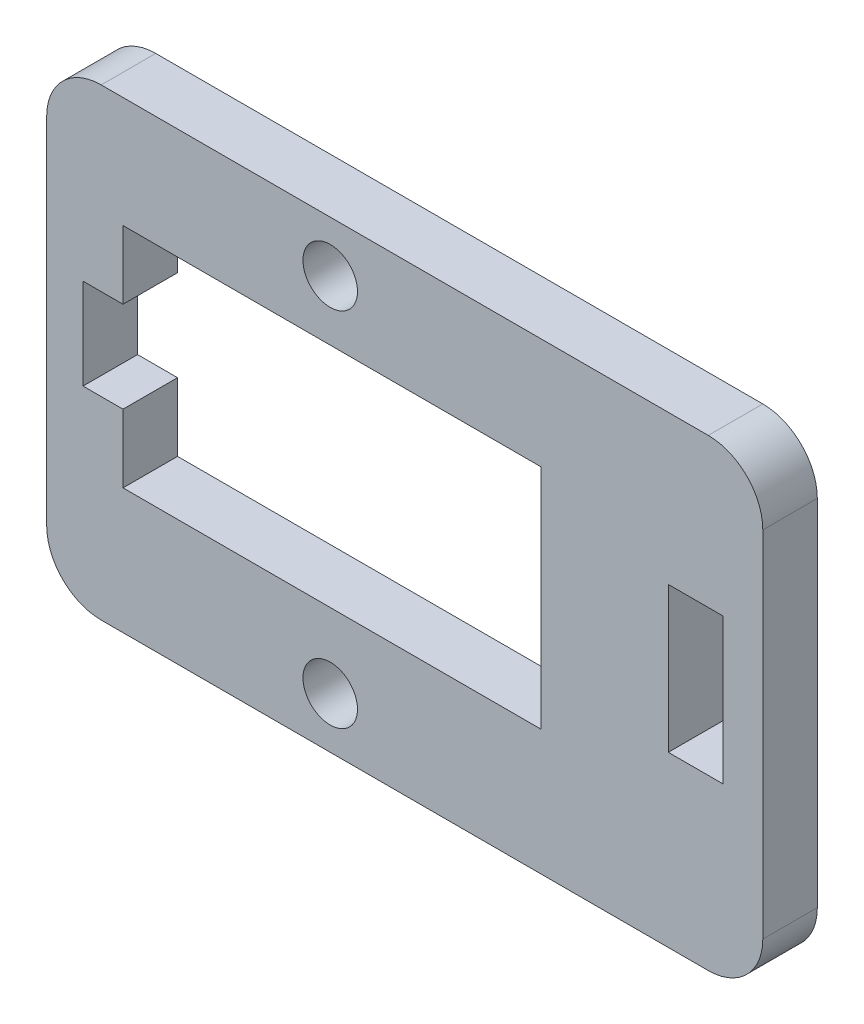
ISO-10303-21;
HEADER;
FILE_DESCRIPTION(('STEP AP214'),'2;1');
FILE_NAME('part.step','',(''),(''),'','','');
FILE_SCHEMA(('AUTOMOTIVE_DESIGN { 1 0 10303 214 1 1 1 1 }'));
ENDSEC;
DATA;
#1=APPLICATION_CONTEXT('core data for automotive mechanical design processes');
#2=APPLICATION_PROTOCOL_DEFINITION('international standard','automotive_design',2000,#1);
#3=PRODUCT_CONTEXT('',#1,'mechanical');
#4=PRODUCT('Part','Part','',(#3));
#5=PRODUCT_RELATED_PRODUCT_CATEGORY('part','',(#4));
#6=PRODUCT_DEFINITION_FORMATION('','',#4);
#7=PRODUCT_DEFINITION_CONTEXT('part definition',#1,'design');
#8=PRODUCT_DEFINITION('design','',#6,#7);
#9=PRODUCT_DEFINITION_SHAPE('','',#8);
#10=(LENGTH_UNIT() NAMED_UNIT(*) SI_UNIT(.MILLI.,.METRE.));
#11=(NAMED_UNIT(*) PLANE_ANGLE_UNIT() SI_UNIT($,.RADIAN.));
#12=(NAMED_UNIT(*) SI_UNIT($,.STERADIAN.) SOLID_ANGLE_UNIT());
#13=UNCERTAINTY_MEASURE_WITH_UNIT(LENGTH_MEASURE(1.E-05),#10,'distance_accuracy_value','');
#14=(GEOMETRIC_REPRESENTATION_CONTEXT(3) GLOBAL_UNCERTAINTY_ASSIGNED_CONTEXT((#13)) GLOBAL_UNIT_ASSIGNED_CONTEXT((#10,
#11,#12)) REPRESENTATION_CONTEXT('',''));
#15=CARTESIAN_POINT('',(0.,0.,0.));
#16=DIRECTION('',(0.,0.,1.));
#17=DIRECTION('',(1.,0.,0.));
#18=AXIS2_PLACEMENT_3D('',#15,#16,#17);
#19=CARTESIAN_POINT('',(853.5431015994,2007.83579040238,-3.));
#20=DIRECTION('',(-1.,0.,0.));
#21=DIRECTION('',(0.,0.,1.));
#22=AXIS2_PLACEMENT_3D('',#19,#20,#21);
#23=PLANE('',#22);
#24=DIRECTION('',(0.,-1.,0.));
#25=VECTOR('',#24,1.);
#26=CARTESIAN_POINT('',(853.5431015994,2007.83579040238,-3.));
#27=LINE('',#26,#25);
#28=CARTESIAN_POINT('',(853.5431015994,2004.83579040238,-3.));
#29=VERTEX_POINT('',#28);
#30=CARTESIAN_POINT('',(853.5431015994,1985.33579040238,-3.));
#31=VERTEX_POINT('',#30);
#32=EDGE_CURVE('E296',#29,#31,#27,.T.);
#33=ORIENTED_EDGE('',*,*,#32,.T.);
#34=DIRECTION('',(0.,0.,1.));
#35=VECTOR('',#34,1.);
#36=CARTESIAN_POINT('',(853.5431015994,1985.33579040238,-3.));
#37=LINE('',#36,#35);
#38=CARTESIAN_POINT('',(853.5431015994,1985.33579040238,0.));
#39=VERTEX_POINT('',#38);
#40=EDGE_CURVE('E320',#31,#39,#37,.T.);
#41=ORIENTED_EDGE('',*,*,#40,.T.);
#42=DIRECTION('',(0.,-1.,0.));
#43=VECTOR('',#42,1.);
#44=CARTESIAN_POINT('',(853.5431015994,2007.83579040238,0.));
#45=LINE('',#44,#43);
#46=CARTESIAN_POINT('',(853.5431015994,2004.83579040238,0.));
#47=VERTEX_POINT('',#46);
#48=EDGE_CURVE('E281',#47,#39,#45,.T.);
#49=ORIENTED_EDGE('',*,*,#48,.F.);
#50=DIRECTION('',(0.,0.,1.));
#51=VECTOR('',#50,1.);
#52=CARTESIAN_POINT('',(853.5431015994,2004.83579040238,-3.));
#53=LINE('',#52,#51);
#54=EDGE_CURVE('E308',#47,#29,#53,.F.);
#55=ORIENTED_EDGE('',*,*,#54,.T.);
#56=EDGE_LOOP('',(#33,#41,#49,#55));
#57=FACE_BOUND('',#56,.T.);
#58=ADVANCED_FACE('F38',(#57),#23,.T.);
#59=CARTESIAN_POINT('',(853.5431015994,2007.83579040238,-3.));
#60=DIRECTION('',(0.,1.,0.));
#61=DIRECTION('',(0.,0.,1.));
#62=AXIS2_PLACEMENT_3D('',#59,#60,#61);
#63=PLANE('',#62);
#64=DIRECTION('',(-1.,0.,0.));
#65=VECTOR('',#64,1.);
#66=CARTESIAN_POINT('',(853.5431015994,2007.83579040238,0.));
#67=LINE('',#66,#65);
#68=CARTESIAN_POINT('',(889.9431015994,2007.83579040238,0.));
#69=VERTEX_POINT('',#68);
#70=CARTESIAN_POINT('',(856.5431015994,2007.83579040238,0.));
#71=VERTEX_POINT('',#70);
#72=EDGE_CURVE('E300',#69,#71,#67,.T.);
#73=ORIENTED_EDGE('',*,*,#72,.F.);
#74=DIRECTION('',(0.,0.,1.));
#75=VECTOR('',#74,1.);
#76=CARTESIAN_POINT('',(889.9431015994,2007.83579040238,-3.));
#77=LINE('',#76,#75);
#78=CARTESIAN_POINT('',(889.9431015994,2007.83579040238,-3.));
#79=VERTEX_POINT('',#78);
#80=EDGE_CURVE('E11',#69,#79,#77,.F.);
#81=ORIENTED_EDGE('',*,*,#80,.T.);
#82=DIRECTION('',(-1.,0.,0.));
#83=VECTOR('',#82,1.);
#84=CARTESIAN_POINT('',(853.5431015994,2007.83579040238,-3.));
#85=LINE('',#84,#83);
#86=CARTESIAN_POINT('',(856.5431015994,2007.83579040238,-3.));
#87=VERTEX_POINT('',#86);
#88=EDGE_CURVE('E305',#79,#87,#85,.T.);
#89=ORIENTED_EDGE('',*,*,#88,.T.);
#90=DIRECTION('',(0.,0.,1.));
#91=VECTOR('',#90,1.);
#92=CARTESIAN_POINT('',(856.5431015994,2007.83579040238,-3.));
#93=LINE('',#92,#91);
#94=EDGE_CURVE('E46',#87,#71,#93,.T.);
#95=ORIENTED_EDGE('',*,*,#94,.T.);
#96=EDGE_LOOP('',(#73,#81,#89,#95));
#97=FACE_BOUND('',#96,.T.);
#98=ADVANCED_FACE('F350',(#97),#63,.T.);
#99=CARTESIAN_POINT('',(892.9431015994,1982.33579040238,-3.));
#100=DIRECTION('',(1.,0.,0.));
#101=DIRECTION('',(0.,0.,-1.));
#102=AXIS2_PLACEMENT_3D('',#99,#100,#101);
#103=PLANE('',#102);
#104=DIRECTION('',(0.,1.,0.));
#105=VECTOR('',#104,1.);
#106=CARTESIAN_POINT('',(892.9431015994,1982.33579040238,0.));
#107=LINE('',#106,#105);
#108=CARTESIAN_POINT('',(892.9431015994,1985.33579040238,0.));
#109=VERTEX_POINT('',#108);
#110=CARTESIAN_POINT('',(892.9431015994,2004.83579040238,0.));
#111=VERTEX_POINT('',#110);
#112=EDGE_CURVE('E314',#109,#111,#107,.T.);
#113=ORIENTED_EDGE('',*,*,#112,.F.);
#114=DIRECTION('',(0.,0.,1.));
#115=VECTOR('',#114,1.);
#116=CARTESIAN_POINT('',(892.9431015994,1985.33579040238,-3.));
#117=LINE('',#116,#115);
#118=CARTESIAN_POINT('',(892.9431015994,1985.33579040238,-3.));
#119=VERTEX_POINT('',#118);
#120=EDGE_CURVE('E60',#109,#119,#117,.F.);
#121=ORIENTED_EDGE('',*,*,#120,.T.);
#122=DIRECTION('',(0.,1.,0.));
#123=VECTOR('',#122,1.);
#124=CARTESIAN_POINT('',(892.9431015994,1982.33579040238,-3.));
#125=LINE('',#124,#123);
#126=CARTESIAN_POINT('',(892.9431015994,2004.83579040238,-3.));
#127=VERTEX_POINT('',#126);
#128=EDGE_CURVE('E303',#119,#127,#125,.T.);
#129=ORIENTED_EDGE('',*,*,#128,.T.);
#130=DIRECTION('',(0.,0.,1.));
#131=VECTOR('',#130,1.);
#132=CARTESIAN_POINT('',(892.9431015994,2004.83579040238,-3.));
#133=LINE('',#132,#131);
#134=EDGE_CURVE('E343',#127,#111,#133,.T.);
#135=ORIENTED_EDGE('',*,*,#134,.T.);
#136=EDGE_LOOP('',(#113,#121,#129,#135));
#137=FACE_BOUND('',#136,.T.);
#138=ADVANCED_FACE('F360',(#137),#103,.T.);
#139=CARTESIAN_POINT('',(853.5431015994,1982.33579040238,-3.));
#140=DIRECTION('',(0.,-1.,0.));
#141=DIRECTION('',(0.,0.,-1.));
#142=AXIS2_PLACEMENT_3D('',#139,#140,#141);
#143=PLANE('',#142);
#144=DIRECTION('',(1.,0.,0.));
#145=VECTOR('',#144,1.);
#146=CARTESIAN_POINT('',(853.5431015994,1982.33579040238,0.));
#147=LINE('',#146,#145);
#148=CARTESIAN_POINT('',(856.5431015994,1982.33579040238,0.));
#149=VERTEX_POINT('',#148);
#150=CARTESIAN_POINT('',(889.9431015994,1982.33579040238,0.));
#151=VERTEX_POINT('',#150);
#152=EDGE_CURVE('E311',#149,#151,#147,.T.);
#153=ORIENTED_EDGE('',*,*,#152,.F.);
#154=DIRECTION('',(0.,0.,1.));
#155=VECTOR('',#154,1.);
#156=CARTESIAN_POINT('',(856.5431015994,1982.33579040238,-3.));
#157=LINE('',#156,#155);
#158=CARTESIAN_POINT('',(856.5431015994,1982.33579040238,-3.));
#159=VERTEX_POINT('',#158);
#160=EDGE_CURVE('E334',#149,#159,#157,.F.);
#161=ORIENTED_EDGE('',*,*,#160,.T.);
#162=DIRECTION('',(1.,0.,0.));
#163=VECTOR('',#162,1.);
#164=CARTESIAN_POINT('',(853.5431015994,1982.33579040238,-3.));
#165=LINE('',#164,#163);
#166=CARTESIAN_POINT('',(889.9431015994,1982.33579040238,-3.));
#167=VERTEX_POINT('',#166);
#168=EDGE_CURVE('E299',#159,#167,#165,.T.);
#169=ORIENTED_EDGE('',*,*,#168,.T.);
#170=DIRECTION('',(0.,0.,1.));
#171=VECTOR('',#170,1.);
#172=CARTESIAN_POINT('',(889.9431015994,1982.33579040238,-3.));
#173=LINE('',#172,#171);
#174=EDGE_CURVE('E331',#167,#151,#173,.T.);
#175=ORIENTED_EDGE('',*,*,#174,.T.);
#176=EDGE_LOOP('',(#153,#161,#169,#175));
#177=FACE_BOUND('',#176,.T.);
#178=ADVANCED_FACE('F368',(#177),#143,.T.);
#179=CARTESIAN_POINT('',(0.,0.,-3.));
#180=DIRECTION('',(0.,0.,1.));
#181=DIRECTION('',(1.,0.,0.));
#182=AXIS2_PLACEMENT_3D('',#179,#180,#181);
#183=PLANE('',#182);
#184=DIRECTION('',(-1.,0.,0.));
#185=VECTOR('',#184,1.);
#186=CARTESIAN_POINT('',(887.743101599399,1999.63579040238,-3.));
#187=LINE('',#186,#185);
#188=CARTESIAN_POINT('',(890.743101599399,1999.63579040238,-3.));
#189=VERTEX_POINT('',#188);
#190=CARTESIAN_POINT('',(887.743101599399,1999.63579040238,-3.));
#191=VERTEX_POINT('',#190);
#192=EDGE_CURVE('E188',#189,#191,#187,.T.);
#193=ORIENTED_EDGE('',*,*,#192,.T.);
#194=DIRECTION('',(0.,-1.,0.));
#195=VECTOR('',#194,1.);
#196=CARTESIAN_POINT('',(887.743101599399,1999.63579040238,-3.));
#197=LINE('',#196,#195);
#198=CARTESIAN_POINT('',(887.743101599399,1991.63579040238,-3.));
#199=VERTEX_POINT('',#198);
#200=EDGE_CURVE('E180',#191,#199,#197,.T.);
#201=ORIENTED_EDGE('',*,*,#200,.T.);
#202=DIRECTION('',(1.,0.,0.));
#203=VECTOR('',#202,1.);
#204=CARTESIAN_POINT('',(887.743101599399,1991.63579040238,-3.));
#205=LINE('',#204,#203);
#206=CARTESIAN_POINT('',(890.743101599399,1991.63579040238,-3.));
#207=VERTEX_POINT('',#206);
#208=EDGE_CURVE('E192',#199,#207,#205,.T.);
#209=ORIENTED_EDGE('',*,*,#208,.T.);
#210=DIRECTION('',(0.,1.,0.));
#211=VECTOR('',#210,1.);
#212=CARTESIAN_POINT('',(890.743101599399,1999.63579040238,-3.));
#213=LINE('',#212,#211);
#214=EDGE_CURVE('E196',#207,#189,#213,.T.);
#215=ORIENTED_EDGE('',*,*,#214,.T.);
#216=EDGE_LOOP('',(#193,#201,#209,#215));
#217=FACE_BOUND('',#216,.T.);
#218=CARTESIAN_POINT('',(869.143101599399,1985.13557748833,-3.));
#219=DIRECTION('',(0.,0.,1.));
#220=DIRECTION('',(1.,0.,0.));
#221=AXIS2_PLACEMENT_3D('',#218,#219,#220);
#222=CIRCLE('',#221,1.49999999999994);
#223=CARTESIAN_POINT('',(870.643101599399,1985.13557748833,-3.));
#224=VERTEX_POINT('',#223);
#225=EDGE_CURVE('E220',#224,#224,#222,.T.);
#226=ORIENTED_EDGE('',*,*,#225,.T.);
#227=EDGE_LOOP('',(#226));
#228=FACE_BOUND('',#227,.T.);
#229=CARTESIAN_POINT('',(869.143101599399,2005.03579040238,-3.));
#230=DIRECTION('',(0.,0.,1.));
#231=DIRECTION('',(1.,0.,0.));
#232=AXIS2_PLACEMENT_3D('',#229,#230,#231);
#233=CIRCLE('',#232,1.49999999999994);
#234=CARTESIAN_POINT('',(870.643101599399,2005.03579040238,-3.));
#235=VERTEX_POINT('',#234);
#236=EDGE_CURVE('E226',#235,#235,#233,.T.);
#237=ORIENTED_EDGE('',*,*,#236,.T.);
#238=EDGE_LOOP('',(#237));
#239=FACE_BOUND('',#238,.T.);
#240=DIRECTION('',(-1.,0.,0.));
#241=VECTOR('',#240,1.);
#242=CARTESIAN_POINT('',(857.743101599399,2001.73579040238,-3.));
#243=LINE('',#242,#241);
#244=CARTESIAN_POINT('',(880.743101599399,2001.73579040238,-3.));
#245=VERTEX_POINT('',#244);
#246=CARTESIAN_POINT('',(857.743101599399,2001.73579040238,-3.));
#247=VERTEX_POINT('',#246);
#248=EDGE_CURVE('E254',#245,#247,#243,.T.);
#249=ORIENTED_EDGE('',*,*,#248,.T.);
#250=DIRECTION('',(0.,-1.,0.));
#251=VECTOR('',#250,1.);
#252=CARTESIAN_POINT('',(857.743101599399,2001.73579040238,-3.));
#253=LINE('',#252,#251);
#254=CARTESIAN_POINT('',(857.743101599399,1997.98579040238,-3.));
#255=VERTEX_POINT('',#254);
#256=EDGE_CURVE('E232',#247,#255,#253,.T.);
#257=ORIENTED_EDGE('',*,*,#256,.T.);
#258=DIRECTION('',(-1.,0.,0.));
#259=VECTOR('',#258,1.);
#260=CARTESIAN_POINT('',(857.743101599399,1997.98579040238,-3.));
#261=LINE('',#260,#259);
#262=CARTESIAN_POINT('',(855.543101599399,1997.98579040238,-3.));
#263=VERTEX_POINT('',#262);
#264=EDGE_CURVE('E235',#255,#263,#261,.T.);
#265=ORIENTED_EDGE('',*,*,#264,.T.);
#266=DIRECTION('',(0.,-1.,0.));
#267=VECTOR('',#266,1.);
#268=CARTESIAN_POINT('',(855.543101599399,1997.98579040238,-3.));
#269=LINE('',#268,#267);
#270=CARTESIAN_POINT('',(855.543101599399,1992.98579040238,-3.));
#271=VERTEX_POINT('',#270);
#272=EDGE_CURVE('E239',#263,#271,#269,.T.);
#273=ORIENTED_EDGE('',*,*,#272,.T.);
#274=DIRECTION('',(1.,0.,0.));
#275=VECTOR('',#274,1.);
#276=CARTESIAN_POINT('',(855.543101599399,1992.98579040238,-3.));
#277=LINE('',#276,#275);
#278=CARTESIAN_POINT('',(857.743101599399,1992.98579040238,-3.));
#279=VERTEX_POINT('',#278);
#280=EDGE_CURVE('E242',#271,#279,#277,.T.);
#281=ORIENTED_EDGE('',*,*,#280,.T.);
#282=DIRECTION('',(0.,-1.,0.));
#283=VECTOR('',#282,1.);
#284=CARTESIAN_POINT('',(857.743101599399,1992.98579040238,-3.));
#285=LINE('',#284,#283);
#286=CARTESIAN_POINT('',(857.743101599399,1989.23579040238,-3.));
#287=VERTEX_POINT('',#286);
#288=EDGE_CURVE('E245',#279,#287,#285,.T.);
#289=ORIENTED_EDGE('',*,*,#288,.T.);
#290=DIRECTION('',(1.,0.,0.));
#291=VECTOR('',#290,1.);
#292=CARTESIAN_POINT('',(857.743101599399,1989.23579040238,-3.));
#293=LINE('',#292,#291);
#294=CARTESIAN_POINT('',(880.743101599399,1989.23579040238,-3.));
#295=VERTEX_POINT('',#294);
#296=EDGE_CURVE('E248',#287,#295,#293,.T.);
#297=ORIENTED_EDGE('',*,*,#296,.T.);
#298=DIRECTION('',(0.,1.,0.));
#299=VECTOR('',#298,1.);
#300=CARTESIAN_POINT('',(880.743101599399,2001.73579040238,-3.));
#301=LINE('',#300,#299);
#302=EDGE_CURVE('E251',#295,#245,#301,.T.);
#303=ORIENTED_EDGE('',*,*,#302,.T.);
#304=EDGE_LOOP('',(#249,#257,#265,#273,#281,#289,#297,#303));
#305=FACE_BOUND('',#304,.T.);
#306=ORIENTED_EDGE('',*,*,#168,.F.);
#307=CARTESIAN_POINT('',(856.5431015994,1985.33579040238,-3.));
#308=DIRECTION('',(0.,0.,1.));
#309=DIRECTION('',(1.,0.,0.));
#310=AXIS2_PLACEMENT_3D('',#307,#308,#309);
#311=CIRCLE('',#310,3.);
#312=EDGE_CURVE('E341',#159,#31,#311,.F.);
#313=ORIENTED_EDGE('',*,*,#312,.T.);
#314=ORIENTED_EDGE('',*,*,#32,.F.);
#315=CARTESIAN_POINT('',(856.5431015994,2004.83579040238,-3.));
#316=DIRECTION('',(0.,0.,1.));
#317=DIRECTION('',(1.,0.,0.));
#318=AXIS2_PLACEMENT_3D('',#315,#316,#317);
#319=CIRCLE('',#318,3.);
#320=EDGE_CURVE('E336',#29,#87,#319,.F.);
#321=ORIENTED_EDGE('',*,*,#320,.T.);
#322=ORIENTED_EDGE('',*,*,#88,.F.);
#323=CARTESIAN_POINT('',(889.9431015994,2004.83579040238,-3.));
#324=DIRECTION('',(0.,0.,1.));
#325=DIRECTION('',(1.,0.,0.));
#326=AXIS2_PLACEMENT_3D('',#323,#324,#325);
#327=CIRCLE('',#326,3.);
#328=EDGE_CURVE('E53',#79,#127,#327,.F.);
#329=ORIENTED_EDGE('',*,*,#328,.T.);
#330=ORIENTED_EDGE('',*,*,#128,.F.);
#331=CARTESIAN_POINT('',(889.9431015994,1985.33579040238,-3.));
#332=DIRECTION('',(0.,0.,1.));
#333=DIRECTION('',(1.,0.,0.));
#334=AXIS2_PLACEMENT_3D('',#331,#332,#333);
#335=CIRCLE('',#334,3.);
#336=EDGE_CURVE('E339',#119,#167,#335,.F.);
#337=ORIENTED_EDGE('',*,*,#336,.T.);
#338=EDGE_LOOP('',(#306,#313,#314,#321,#322,#329,#330,#337));
#339=FACE_BOUND('',#338,.T.);
#340=ADVANCED_FACE('F198',(#217,#228,#239,#305,#339),#183,.F.);
#341=CARTESIAN_POINT('',(0.,0.,0.));
#342=DIRECTION('',(0.,0.,1.));
#343=DIRECTION('',(1.,0.,0.));
#344=AXIS2_PLACEMENT_3D('',#341,#342,#343);
#345=PLANE('',#344);
#346=DIRECTION('',(0.,-1.,0.));
#347=VECTOR('',#346,1.);
#348=CARTESIAN_POINT('',(887.743101599399,1999.63579040238,0.));
#349=LINE('',#348,#347);
#350=CARTESIAN_POINT('',(887.743101599399,1999.63579040238,0.));
#351=VERTEX_POINT('',#350);
#352=CARTESIAN_POINT('',(887.743101599399,1991.63579040238,0.));
#353=VERTEX_POINT('',#352);
#354=EDGE_CURVE('E183',#351,#353,#349,.T.);
#355=ORIENTED_EDGE('',*,*,#354,.F.);
#356=DIRECTION('',(-1.,0.,0.));
#357=VECTOR('',#356,1.);
#358=CARTESIAN_POINT('',(887.743101599399,1999.63579040238,0.));
#359=LINE('',#358,#357);
#360=CARTESIAN_POINT('',(890.743101599399,1999.63579040238,0.));
#361=VERTEX_POINT('',#360);
#362=EDGE_CURVE('E201',#361,#351,#359,.T.);
#363=ORIENTED_EDGE('',*,*,#362,.F.);
#364=DIRECTION('',(0.,1.,0.));
#365=VECTOR('',#364,1.);
#366=CARTESIAN_POINT('',(890.743101599399,1999.63579040238,0.));
#367=LINE('',#366,#365);
#368=CARTESIAN_POINT('',(890.743101599399,1991.63579040238,0.));
#369=VERTEX_POINT('',#368);
#370=EDGE_CURVE('E204',#369,#361,#367,.T.);
#371=ORIENTED_EDGE('',*,*,#370,.F.);
#372=DIRECTION('',(1.,0.,0.));
#373=VECTOR('',#372,1.);
#374=CARTESIAN_POINT('',(887.743101599399,1991.63579040238,0.));
#375=LINE('',#374,#373);
#376=EDGE_CURVE('E210',#353,#369,#375,.T.);
#377=ORIENTED_EDGE('',*,*,#376,.F.);
#378=EDGE_LOOP('',(#355,#363,#371,#377));
#379=FACE_BOUND('',#378,.T.);
#380=CARTESIAN_POINT('',(869.143101599399,1985.13557748833,0.));
#381=DIRECTION('',(0.,0.,1.));
#382=DIRECTION('',(1.,0.,0.));
#383=AXIS2_PLACEMENT_3D('',#380,#381,#382);
#384=CIRCLE('',#383,1.49999999999994);
#385=CARTESIAN_POINT('',(870.643101599399,1985.13557748833,0.));
#386=VERTEX_POINT('',#385);
#387=EDGE_CURVE('E216',#386,#386,#384,.T.);
#388=ORIENTED_EDGE('',*,*,#387,.F.);
#389=EDGE_LOOP('',(#388));
#390=FACE_BOUND('',#389,.T.);
#391=CARTESIAN_POINT('',(869.143101599399,2005.03579040238,0.));
#392=DIRECTION('',(0.,0.,1.));
#393=DIRECTION('',(1.,0.,0.));
#394=AXIS2_PLACEMENT_3D('',#391,#392,#393);
#395=CIRCLE('',#394,1.49999999999994);
#396=CARTESIAN_POINT('',(870.643101599399,2005.03579040238,0.));
#397=VERTEX_POINT('',#396);
#398=EDGE_CURVE('E223',#397,#397,#395,.T.);
#399=ORIENTED_EDGE('',*,*,#398,.F.);
#400=EDGE_LOOP('',(#399));
#401=FACE_BOUND('',#400,.T.);
#402=DIRECTION('',(0.,-1.,0.));
#403=VECTOR('',#402,1.);
#404=CARTESIAN_POINT('',(857.743101599399,2001.73579040238,0.));
#405=LINE('',#404,#403);
#406=CARTESIAN_POINT('',(857.743101599399,2001.73579040238,0.));
#407=VERTEX_POINT('',#406);
#408=CARTESIAN_POINT('',(857.743101599399,1997.98579040238,0.));
#409=VERTEX_POINT('',#408);
#410=EDGE_CURVE('E229',#407,#409,#405,.T.);
#411=ORIENTED_EDGE('',*,*,#410,.F.);
#412=DIRECTION('',(-1.,0.,0.));
#413=VECTOR('',#412,1.);
#414=CARTESIAN_POINT('',(857.743101599399,2001.73579040238,0.));
#415=LINE('',#414,#413);
#416=CARTESIAN_POINT('',(880.743101599399,2001.73579040238,0.));
#417=VERTEX_POINT('',#416);
#418=EDGE_CURVE('E236',#417,#407,#415,.T.);
#419=ORIENTED_EDGE('',*,*,#418,.F.);
#420=DIRECTION('',(0.,1.,0.));
#421=VECTOR('',#420,1.);
#422=CARTESIAN_POINT('',(880.743101599399,2001.73579040238,0.));
#423=LINE('',#422,#421);
#424=CARTESIAN_POINT('',(880.743101599399,1989.23579040238,0.));
#425=VERTEX_POINT('',#424);
#426=EDGE_CURVE('E274',#425,#417,#423,.T.);
#427=ORIENTED_EDGE('',*,*,#426,.F.);
#428=DIRECTION('',(1.,0.,0.));
#429=VECTOR('',#428,1.);
#430=CARTESIAN_POINT('',(857.743101599399,1989.23579040238,0.));
#431=LINE('',#430,#429);
#432=CARTESIAN_POINT('',(857.743101599399,1989.23579040238,0.));
#433=VERTEX_POINT('',#432);
#434=EDGE_CURVE('E271',#433,#425,#431,.T.);
#435=ORIENTED_EDGE('',*,*,#434,.F.);
#436=DIRECTION('',(0.,-1.,0.));
#437=VECTOR('',#436,1.);
#438=CARTESIAN_POINT('',(857.743101599399,1992.98579040238,0.));
#439=LINE('',#438,#437);
#440=CARTESIAN_POINT('',(857.743101599399,1992.98579040238,0.));
#441=VERTEX_POINT('',#440);
#442=EDGE_CURVE('E268',#441,#433,#439,.T.);
#443=ORIENTED_EDGE('',*,*,#442,.F.);
#444=DIRECTION('',(1.,0.,0.));
#445=VECTOR('',#444,1.);
#446=CARTESIAN_POINT('',(855.543101599399,1992.98579040238,0.));
#447=LINE('',#446,#445);
#448=CARTESIAN_POINT('',(855.543101599399,1992.98579040238,0.));
#449=VERTEX_POINT('',#448);
#450=EDGE_CURVE('E265',#449,#441,#447,.T.);
#451=ORIENTED_EDGE('',*,*,#450,.F.);
#452=DIRECTION('',(0.,-1.,0.));
#453=VECTOR('',#452,1.);
#454=CARTESIAN_POINT('',(855.543101599399,1997.98579040238,0.));
#455=LINE('',#454,#453);
#456=CARTESIAN_POINT('',(855.543101599399,1997.98579040238,0.));
#457=VERTEX_POINT('',#456);
#458=EDGE_CURVE('E262',#457,#449,#455,.T.);
#459=ORIENTED_EDGE('',*,*,#458,.F.);
#460=DIRECTION('',(-1.,0.,0.));
#461=VECTOR('',#460,1.);
#462=CARTESIAN_POINT('',(857.743101599399,1997.98579040238,0.));
#463=LINE('',#462,#461);
#464=EDGE_CURVE('E259',#409,#457,#463,.T.);
#465=ORIENTED_EDGE('',*,*,#464,.F.);
#466=EDGE_LOOP('',(#411,#419,#427,#435,#443,#451,#459,#465));
#467=FACE_BOUND('',#466,.T.);
#468=ORIENTED_EDGE('',*,*,#48,.T.);
#469=CARTESIAN_POINT('',(856.5431015994,1985.33579040238,0.));
#470=DIRECTION('',(0.,0.,1.));
#471=DIRECTION('',(1.,0.,0.));
#472=AXIS2_PLACEMENT_3D('',#469,#470,#471);
#473=CIRCLE('',#472,3.);
#474=EDGE_CURVE('E329',#39,#149,#473,.T.);
#475=ORIENTED_EDGE('',*,*,#474,.T.);
#476=ORIENTED_EDGE('',*,*,#152,.T.);
#477=CARTESIAN_POINT('',(889.9431015994,1985.33579040238,0.));
#478=DIRECTION('',(0.,0.,1.));
#479=DIRECTION('',(1.,0.,0.));
#480=AXIS2_PLACEMENT_3D('',#477,#478,#479);
#481=CIRCLE('',#480,3.);
#482=EDGE_CURVE('E327',#151,#109,#481,.T.);
#483=ORIENTED_EDGE('',*,*,#482,.T.);
#484=ORIENTED_EDGE('',*,*,#112,.T.);
#485=CARTESIAN_POINT('',(889.9431015994,2004.83579040238,0.));
#486=DIRECTION('',(0.,0.,1.));
#487=DIRECTION('',(1.,0.,0.));
#488=AXIS2_PLACEMENT_3D('',#485,#486,#487);
#489=CIRCLE('',#488,3.);
#490=EDGE_CURVE('E325',#111,#69,#489,.T.);
#491=ORIENTED_EDGE('',*,*,#490,.T.);
#492=ORIENTED_EDGE('',*,*,#72,.T.);
#493=CARTESIAN_POINT('',(856.5431015994,2004.83579040238,0.));
#494=DIRECTION('',(0.,0.,1.));
#495=DIRECTION('',(1.,0.,0.));
#496=AXIS2_PLACEMENT_3D('',#493,#494,#495);
#497=CIRCLE('',#496,3.);
#498=EDGE_CURVE('E323',#71,#47,#497,.T.);
#499=ORIENTED_EDGE('',*,*,#498,.T.);
#500=EDGE_LOOP('',(#468,#475,#476,#483,#484,#491,#492,#499));
#501=FACE_BOUND('',#500,.T.);
#502=ADVANCED_FACE('F355',(#379,#390,#401,#467,#501),#345,.T.);
#503=CARTESIAN_POINT('',(857.743101599399,2001.73579040238,-3.));
#504=DIRECTION('',(-1.,0.,0.));
#505=DIRECTION('',(0.,0.,1.));
#506=AXIS2_PLACEMENT_3D('',#503,#504,#505);
#507=PLANE('',#506);
#508=ORIENTED_EDGE('',*,*,#410,.T.);
#509=DIRECTION('',(0.,0.,1.));
#510=VECTOR('',#509,1.);
#511=CARTESIAN_POINT('',(857.743101599399,1997.98579040238,-3.));
#512=LINE('',#511,#510);
#513=EDGE_CURVE('E257',#255,#409,#512,.T.);
#514=ORIENTED_EDGE('',*,*,#513,.F.);
#515=ORIENTED_EDGE('',*,*,#256,.F.);
#516=DIRECTION('',(0.,0.,1.));
#517=VECTOR('',#516,1.);
#518=CARTESIAN_POINT('',(857.743101599399,2001.73579040238,-3.));
#519=LINE('',#518,#517);
#520=EDGE_CURVE('E279',#247,#407,#519,.T.);
#521=ORIENTED_EDGE('',*,*,#520,.T.);
#522=EDGE_LOOP('',(#508,#514,#515,#521));
#523=FACE_BOUND('',#522,.T.);
#524=ADVANCED_FACE('F552',(#523),#507,.F.);
#525=CARTESIAN_POINT('',(857.743101599399,2001.73579040238,-3.));
#526=DIRECTION('',(0.,1.,0.));
#527=DIRECTION('',(0.,0.,1.));
#528=AXIS2_PLACEMENT_3D('',#525,#526,#527);
#529=PLANE('',#528);
#530=ORIENTED_EDGE('',*,*,#418,.T.);
#531=ORIENTED_EDGE('',*,*,#520,.F.);
#532=ORIENTED_EDGE('',*,*,#248,.F.);
#533=DIRECTION('',(0.,0.,1.));
#534=VECTOR('',#533,1.);
#535=CARTESIAN_POINT('',(880.743101599399,2001.73579040238,-3.));
#536=LINE('',#535,#534);
#537=EDGE_CURVE('E282',#245,#417,#536,.T.);
#538=ORIENTED_EDGE('',*,*,#537,.T.);
#539=EDGE_LOOP('',(#530,#531,#532,#538));
#540=FACE_BOUND('',#539,.T.);
#541=ADVANCED_FACE('F541',(#540),#529,.F.);
#542=CARTESIAN_POINT('',(880.743101599399,2001.73579040238,-3.));
#543=DIRECTION('',(1.,0.,0.));
#544=DIRECTION('',(0.,1.,0.));
#545=AXIS2_PLACEMENT_3D('',#542,#543,#544);
#546=PLANE('',#545);
#547=ORIENTED_EDGE('',*,*,#426,.T.);
#548=ORIENTED_EDGE('',*,*,#537,.F.);
#549=ORIENTED_EDGE('',*,*,#302,.F.);
#550=DIRECTION('',(0.,0.,1.));
#551=VECTOR('',#550,1.);
#552=CARTESIAN_POINT('',(880.743101599399,1989.23579040238,-3.));
#553=LINE('',#552,#551);
#554=EDGE_CURVE('E284',#295,#425,#553,.T.);
#555=ORIENTED_EDGE('',*,*,#554,.T.);
#556=EDGE_LOOP('',(#547,#548,#549,#555));
#557=FACE_BOUND('',#556,.T.);
#558=ADVANCED_FACE('F530',(#557),#546,.F.);
#559=CARTESIAN_POINT('',(857.743101599399,1989.23579040238,-3.));
#560=DIRECTION('',(0.,-1.,0.));
#561=DIRECTION('',(0.,0.,-1.));
#562=AXIS2_PLACEMENT_3D('',#559,#560,#561);
#563=PLANE('',#562);
#564=ORIENTED_EDGE('',*,*,#434,.T.);
#565=ORIENTED_EDGE('',*,*,#554,.F.);
#566=ORIENTED_EDGE('',*,*,#296,.F.);
#567=DIRECTION('',(0.,0.,1.));
#568=VECTOR('',#567,1.);
#569=CARTESIAN_POINT('',(857.743101599399,1989.23579040238,-3.));
#570=LINE('',#569,#568);
#571=EDGE_CURVE('E286',#287,#433,#570,.T.);
#572=ORIENTED_EDGE('',*,*,#571,.T.);
#573=EDGE_LOOP('',(#564,#565,#566,#572));
#574=FACE_BOUND('',#573,.T.);
#575=ADVANCED_FACE('F519',(#574),#563,.F.);
#576=CARTESIAN_POINT('',(857.743101599399,1992.98579040238,-3.));
#577=DIRECTION('',(-1.,0.,0.));
#578=DIRECTION('',(0.,0.,1.));
#579=AXIS2_PLACEMENT_3D('',#576,#577,#578);
#580=PLANE('',#579);
#581=ORIENTED_EDGE('',*,*,#442,.T.);
#582=ORIENTED_EDGE('',*,*,#571,.F.);
#583=ORIENTED_EDGE('',*,*,#288,.F.);
#584=DIRECTION('',(0.,0.,1.));
#585=VECTOR('',#584,1.);
#586=CARTESIAN_POINT('',(857.743101599399,1992.98579040238,-3.));
#587=LINE('',#586,#585);
#588=EDGE_CURVE('E288',#279,#441,#587,.T.);
#589=ORIENTED_EDGE('',*,*,#588,.T.);
#590=EDGE_LOOP('',(#581,#582,#583,#589));
#591=FACE_BOUND('',#590,.T.);
#592=ADVANCED_FACE('F508',(#591),#580,.F.);
#593=CARTESIAN_POINT('',(855.543101599399,1992.98579040238,-3.));
#594=DIRECTION('',(0.,-1.,0.));
#595=DIRECTION('',(0.,0.,-1.));
#596=AXIS2_PLACEMENT_3D('',#593,#594,#595);
#597=PLANE('',#596);
#598=ORIENTED_EDGE('',*,*,#450,.T.);
#599=ORIENTED_EDGE('',*,*,#588,.F.);
#600=ORIENTED_EDGE('',*,*,#280,.F.);
#601=DIRECTION('',(0.,0.,1.));
#602=VECTOR('',#601,1.);
#603=CARTESIAN_POINT('',(855.543101599399,1992.98579040238,-3.));
#604=LINE('',#603,#602);
#605=EDGE_CURVE('E290',#271,#449,#604,.T.);
#606=ORIENTED_EDGE('',*,*,#605,.T.);
#607=EDGE_LOOP('',(#598,#599,#600,#606));
#608=FACE_BOUND('',#607,.T.);
#609=ADVANCED_FACE('F497',(#608),#597,.F.);
#610=CARTESIAN_POINT('',(855.543101599399,1997.98579040238,-3.));
#611=DIRECTION('',(-1.,0.,0.));
#612=DIRECTION('',(0.,0.,1.));
#613=AXIS2_PLACEMENT_3D('',#610,#611,#612);
#614=PLANE('',#613);
#615=ORIENTED_EDGE('',*,*,#458,.T.);
#616=ORIENTED_EDGE('',*,*,#605,.F.);
#617=ORIENTED_EDGE('',*,*,#272,.F.);
#618=DIRECTION('',(0.,0.,1.));
#619=VECTOR('',#618,1.);
#620=CARTESIAN_POINT('',(855.543101599399,1997.98579040238,-3.));
#621=LINE('',#620,#619);
#622=EDGE_CURVE('E292',#263,#457,#621,.T.);
#623=ORIENTED_EDGE('',*,*,#622,.T.);
#624=EDGE_LOOP('',(#615,#616,#617,#623));
#625=FACE_BOUND('',#624,.T.);
#626=ADVANCED_FACE('F486',(#625),#614,.F.);
#627=CARTESIAN_POINT('',(857.743101599399,1997.98579040238,-3.));
#628=DIRECTION('',(0.,1.,0.));
#629=DIRECTION('',(0.,0.,1.));
#630=AXIS2_PLACEMENT_3D('',#627,#628,#629);
#631=PLANE('',#630);
#632=ORIENTED_EDGE('',*,*,#464,.T.);
#633=ORIENTED_EDGE('',*,*,#622,.F.);
#634=ORIENTED_EDGE('',*,*,#264,.F.);
#635=ORIENTED_EDGE('',*,*,#513,.T.);
#636=EDGE_LOOP('',(#632,#633,#634,#635));
#637=FACE_BOUND('',#636,.T.);
#638=ADVANCED_FACE('F475',(#637),#631,.F.);
#639=CARTESIAN_POINT('',(869.143101599399,2005.03579040238,-3.));
#640=DIRECTION('',(0.,0.,1.));
#641=DIRECTION('',(1.,0.,0.));
#642=AXIS2_PLACEMENT_3D('',#639,#640,#641);
#643=CYLINDRICAL_SURFACE('',#642,1.49999999999994);
#644=ORIENTED_EDGE('',*,*,#236,.F.);
#645=EDGE_LOOP('',(#644));
#646=FACE_BOUND('',#645,.T.);
#647=ORIENTED_EDGE('',*,*,#398,.T.);
#648=EDGE_LOOP('',(#647));
#649=FACE_BOUND('',#648,.T.);
#650=ADVANCED_FACE('F464',(#646,#649),#643,.F.);
#651=CARTESIAN_POINT('',(869.143101599399,1985.13557748833,-3.));
#652=DIRECTION('',(0.,0.,1.));
#653=DIRECTION('',(1.,0.,0.));
#654=AXIS2_PLACEMENT_3D('',#651,#652,#653);
#655=CYLINDRICAL_SURFACE('',#654,1.49999999999994);
#656=ORIENTED_EDGE('',*,*,#225,.F.);
#657=EDGE_LOOP('',(#656));
#658=FACE_BOUND('',#657,.T.);
#659=ORIENTED_EDGE('',*,*,#387,.T.);
#660=EDGE_LOOP('',(#659));
#661=FACE_BOUND('',#660,.T.);
#662=ADVANCED_FACE('F454',(#658,#661),#655,.F.);
#663=CARTESIAN_POINT('',(887.743101599399,1999.63579040238,-3.));
#664=DIRECTION('',(-1.,0.,0.));
#665=DIRECTION('',(0.,0.,1.));
#666=AXIS2_PLACEMENT_3D('',#663,#664,#665);
#667=PLANE('',#666);
#668=ORIENTED_EDGE('',*,*,#354,.T.);
#669=DIRECTION('',(0.,0.,1.));
#670=VECTOR('',#669,1.);
#671=CARTESIAN_POINT('',(887.743101599399,1991.63579040238,-3.));
#672=LINE('',#671,#670);
#673=EDGE_CURVE('E176',#199,#353,#672,.T.);
#674=ORIENTED_EDGE('',*,*,#673,.F.);
#675=ORIENTED_EDGE('',*,*,#200,.F.);
#676=DIRECTION('',(0.,0.,1.));
#677=VECTOR('',#676,1.);
#678=CARTESIAN_POINT('',(887.743101599399,1999.63579040238,-3.));
#679=LINE('',#678,#677);
#680=EDGE_CURVE('E214',#191,#351,#679,.T.);
#681=ORIENTED_EDGE('',*,*,#680,.T.);
#682=EDGE_LOOP('',(#668,#674,#675,#681));
#683=FACE_BOUND('',#682,.T.);
#684=ADVANCED_FACE('F178',(#683),#667,.F.);
#685=CARTESIAN_POINT('',(887.743101599399,1999.63579040238,-3.));
#686=DIRECTION('',(0.,1.,0.));
#687=DIRECTION('',(0.,0.,1.));
#688=AXIS2_PLACEMENT_3D('',#685,#686,#687);
#689=PLANE('',#688);
#690=ORIENTED_EDGE('',*,*,#362,.T.);
#691=ORIENTED_EDGE('',*,*,#680,.F.);
#692=ORIENTED_EDGE('',*,*,#192,.F.);
#693=DIRECTION('',(0.,0.,1.));
#694=VECTOR('',#693,1.);
#695=CARTESIAN_POINT('',(890.743101599399,1999.63579040238,-3.));
#696=LINE('',#695,#694);
#697=EDGE_CURVE('E217',#189,#361,#696,.T.);
#698=ORIENTED_EDGE('',*,*,#697,.T.);
#699=EDGE_LOOP('',(#690,#691,#692,#698));
#700=FACE_BOUND('',#699,.T.);
#701=ADVANCED_FACE('F433',(#700),#689,.F.);
#702=CARTESIAN_POINT('',(890.743101599399,1999.63579040238,-3.));
#703=DIRECTION('',(1.,0.,0.));
#704=DIRECTION('',(0.,0.,-1.));
#705=AXIS2_PLACEMENT_3D('',#702,#703,#704);
#706=PLANE('',#705);
#707=ORIENTED_EDGE('',*,*,#370,.T.);
#708=ORIENTED_EDGE('',*,*,#697,.F.);
#709=ORIENTED_EDGE('',*,*,#214,.F.);
#710=DIRECTION('',(0.,0.,1.));
#711=VECTOR('',#710,1.);
#712=CARTESIAN_POINT('',(890.743101599399,1991.63579040238,-3.));
#713=LINE('',#712,#711);
#714=EDGE_CURVE('E187',#207,#369,#713,.T.);
#715=ORIENTED_EDGE('',*,*,#714,.T.);
#716=EDGE_LOOP('',(#707,#708,#709,#715));
#717=FACE_BOUND('',#716,.T.);
#718=ADVANCED_FACE('F423',(#717),#706,.F.);
#719=CARTESIAN_POINT('',(887.743101599399,1991.63579040238,-3.));
#720=DIRECTION('',(0.,-1.,0.));
#721=DIRECTION('',(0.,0.,-1.));
#722=AXIS2_PLACEMENT_3D('',#719,#720,#721);
#723=PLANE('',#722);
#724=ORIENTED_EDGE('',*,*,#376,.T.);
#725=ORIENTED_EDGE('',*,*,#714,.F.);
#726=ORIENTED_EDGE('',*,*,#208,.F.);
#727=ORIENTED_EDGE('',*,*,#673,.T.);
#728=EDGE_LOOP('',(#724,#725,#726,#727));
#729=FACE_BOUND('',#728,.T.);
#730=ADVANCED_FACE('F193',(#729),#723,.F.);
#731=CARTESIAN_POINT('',(856.5431015994,1985.33579040238,-3.));
#732=DIRECTION('',(0.,0.,1.));
#733=DIRECTION('',(1.,0.,0.));
#734=AXIS2_PLACEMENT_3D('',#731,#732,#733);
#735=CYLINDRICAL_SURFACE('',#734,3.);
#736=ORIENTED_EDGE('',*,*,#312,.F.);
#737=ORIENTED_EDGE('',*,*,#160,.F.);
#738=ORIENTED_EDGE('',*,*,#474,.F.);
#739=ORIENTED_EDGE('',*,*,#40,.F.);
#740=EDGE_LOOP('',(#736,#737,#738,#739));
#741=FACE_BOUND('',#740,.T.);
#742=ADVANCED_FACE('F373',(#741),#735,.T.);
#743=CARTESIAN_POINT('',(889.9431015994,1985.33579040238,-3.));
#744=DIRECTION('',(0.,0.,1.));
#745=DIRECTION('',(1.,0.,0.));
#746=AXIS2_PLACEMENT_3D('',#743,#744,#745);
#747=CYLINDRICAL_SURFACE('',#746,3.);
#748=ORIENTED_EDGE('',*,*,#336,.F.);
#749=ORIENTED_EDGE('',*,*,#120,.F.);
#750=ORIENTED_EDGE('',*,*,#482,.F.);
#751=ORIENTED_EDGE('',*,*,#174,.F.);
#752=EDGE_LOOP('',(#748,#749,#750,#751));
#753=FACE_BOUND('',#752,.T.);
#754=ADVANCED_FACE('F365',(#753),#747,.T.);
#755=CARTESIAN_POINT('',(889.9431015994,2004.83579040238,-3.));
#756=DIRECTION('',(0.,0.,1.));
#757=DIRECTION('',(1.,0.,0.));
#758=AXIS2_PLACEMENT_3D('',#755,#756,#757);
#759=CYLINDRICAL_SURFACE('',#758,3.);
#760=ORIENTED_EDGE('',*,*,#328,.F.);
#761=ORIENTED_EDGE('',*,*,#80,.F.);
#762=ORIENTED_EDGE('',*,*,#490,.F.);
#763=ORIENTED_EDGE('',*,*,#134,.F.);
#764=EDGE_LOOP('',(#760,#761,#762,#763));
#765=FACE_BOUND('',#764,.T.);
#766=ADVANCED_FACE('F359',(#765),#759,.T.);
#767=CARTESIAN_POINT('',(856.5431015994,2004.83579040238,-3.));
#768=DIRECTION('',(0.,0.,1.));
#769=DIRECTION('',(1.,0.,0.));
#770=AXIS2_PLACEMENT_3D('',#767,#768,#769);
#771=CYLINDRICAL_SURFACE('',#770,3.);
#772=ORIENTED_EDGE('',*,*,#320,.F.);
#773=ORIENTED_EDGE('',*,*,#54,.F.);
#774=ORIENTED_EDGE('',*,*,#498,.F.);
#775=ORIENTED_EDGE('',*,*,#94,.F.);
#776=EDGE_LOOP('',(#772,#773,#774,#775));
#777=FACE_BOUND('',#776,.T.);
#778=ADVANCED_FACE('F40',(#777),#771,.T.);
#779=CLOSED_SHELL('',(#58,#98,#138,#178,#340,#502,#524,#541,#558,#575,#592,#609,#626,#638,#650,
#662,#684,#701,#718,#730,#742,#754,#766,#778));
#780=MANIFOLD_SOLID_BREP('B2',#779);
#781=ADVANCED_BREP_SHAPE_REPRESENTATION('',(#18,#780),#14);
#782=SHAPE_DEFINITION_REPRESENTATION(#9,#781);
ENDSEC;
END-ISO-10303-21;
